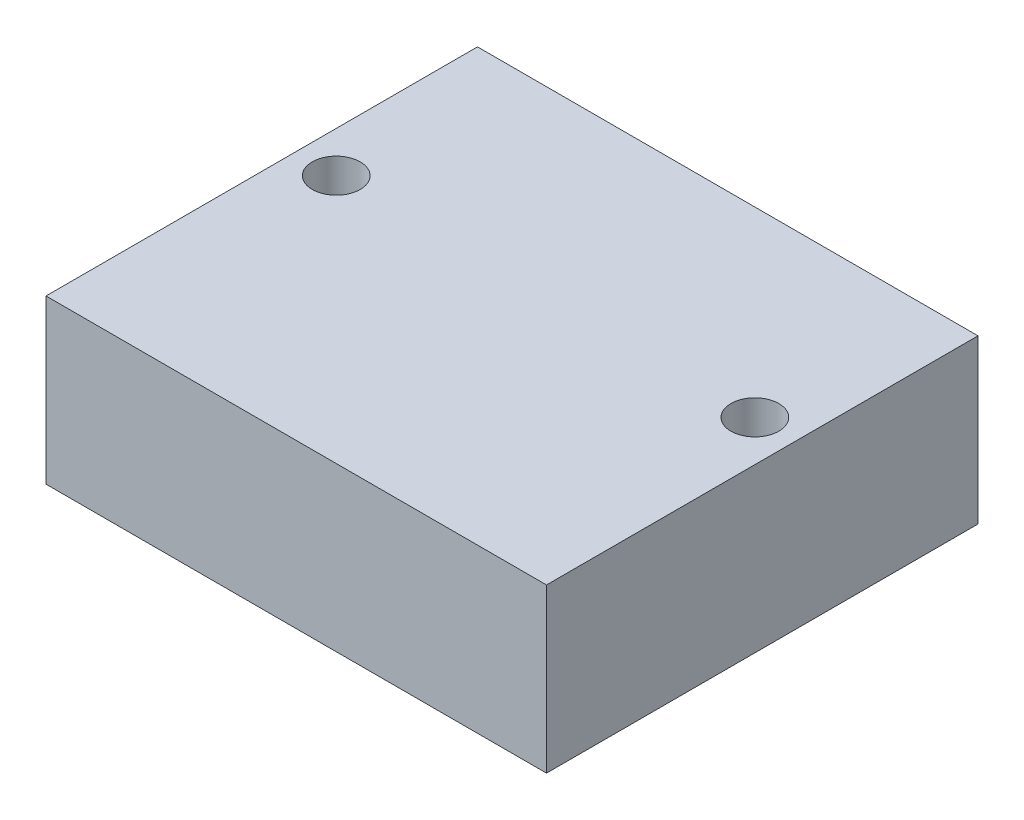
ISO-10303-21;
HEADER;
FILE_DESCRIPTION(('STEP AP214'),'2;1');
FILE_NAME('part.step','',(''),(''),'','','');
FILE_SCHEMA(('AUTOMOTIVE_DESIGN { 1 0 10303 214 1 1 1 1 }'));
ENDSEC;
DATA;
#1=APPLICATION_CONTEXT('core data for automotive mechanical design processes');
#2=APPLICATION_PROTOCOL_DEFINITION('international standard','automotive_design',2000,#1);
#3=PRODUCT_CONTEXT('',#1,'mechanical');
#4=PRODUCT('Part','Part','',(#3));
#5=PRODUCT_RELATED_PRODUCT_CATEGORY('part','',(#4));
#6=PRODUCT_DEFINITION_FORMATION('','',#4);
#7=PRODUCT_DEFINITION_CONTEXT('part definition',#1,'design');
#8=PRODUCT_DEFINITION('design','',#6,#7);
#9=PRODUCT_DEFINITION_SHAPE('','',#8);
#10=(LENGTH_UNIT() NAMED_UNIT(*) SI_UNIT(.MILLI.,.METRE.));
#11=(NAMED_UNIT(*) PLANE_ANGLE_UNIT() SI_UNIT($,.RADIAN.));
#12=(NAMED_UNIT(*) SI_UNIT($,.STERADIAN.) SOLID_ANGLE_UNIT());
#13=UNCERTAINTY_MEASURE_WITH_UNIT(LENGTH_MEASURE(1.E-05),#10,'distance_accuracy_value','');
#14=(GEOMETRIC_REPRESENTATION_CONTEXT(3) GLOBAL_UNCERTAINTY_ASSIGNED_CONTEXT((#13)) GLOBAL_UNIT_ASSIGNED_CONTEXT((#10,
#11,#12)) REPRESENTATION_CONTEXT('',''));
#15=CARTESIAN_POINT('',(0.,0.,0.));
#16=DIRECTION('',(0.,0.,1.));
#17=DIRECTION('',(1.,0.,0.));
#18=AXIS2_PLACEMENT_3D('',#15,#16,#17);
#19=CARTESIAN_POINT('',(33.147,21.59,28.575));
#20=DIRECTION('',(-1.,0.,0.));
#21=DIRECTION('',(0.,0.,1.));
#22=AXIS2_PLACEMENT_3D('',#19,#20,#21);
#23=PLANE('',#22);
#24=DIRECTION('',(0.,0.,-1.));
#25=VECTOR('',#24,1.);
#26=CARTESIAN_POINT('',(33.147,0.,28.575));
#27=LINE('',#26,#25);
#28=CARTESIAN_POINT('',(33.147,0.,28.575));
#29=VERTEX_POINT('',#28);
#30=CARTESIAN_POINT('',(33.147,0.,-28.575));
#31=VERTEX_POINT('',#30);
#32=EDGE_CURVE('E102',#29,#31,#27,.T.);
#33=ORIENTED_EDGE('',*,*,#32,.T.);
#34=DIRECTION('',(0.,-1.,0.));
#35=VECTOR('',#34,1.);
#36=CARTESIAN_POINT('',(33.147,21.59,-28.575));
#37=LINE('',#36,#35);
#38=CARTESIAN_POINT('',(33.147,21.59,-28.575));
#39=VERTEX_POINT('',#38);
#40=EDGE_CURVE('E11',#39,#31,#37,.T.);
#41=ORIENTED_EDGE('',*,*,#40,.F.);
#42=DIRECTION('',(0.,0.,-1.));
#43=VECTOR('',#42,1.);
#44=CARTESIAN_POINT('',(33.147,21.59,28.575));
#45=LINE('',#44,#43);
#46=CARTESIAN_POINT('',(33.147,21.59,28.575));
#47=VERTEX_POINT('',#46);
#48=EDGE_CURVE('E90',#47,#39,#45,.T.);
#49=ORIENTED_EDGE('',*,*,#48,.F.);
#50=DIRECTION('',(0.,-1.,0.));
#51=VECTOR('',#50,1.);
#52=CARTESIAN_POINT('',(33.147,21.59,28.575));
#53=LINE('',#52,#51);
#54=EDGE_CURVE('E98',#47,#29,#53,.T.);
#55=ORIENTED_EDGE('',*,*,#54,.T.);
#56=EDGE_LOOP('',(#33,#41,#49,#55));
#57=FACE_BOUND('',#56,.T.);
#58=ADVANCED_FACE('F39',(#57),#23,.F.);
#59=CARTESIAN_POINT('',(-33.147,21.59,-28.575));
#60=DIRECTION('',(0.,0.,1.));
#61=DIRECTION('',(1.,0.,0.));
#62=AXIS2_PLACEMENT_3D('',#59,#60,#61);
#63=PLANE('',#62);
#64=DIRECTION('',(-1.,0.,0.));
#65=VECTOR('',#64,1.);
#66=CARTESIAN_POINT('',(-33.147,0.,-28.575));
#67=LINE('',#66,#65);
#68=CARTESIAN_POINT('',(-33.147,0.,-28.575));
#69=VERTEX_POINT('',#68);
#70=EDGE_CURVE('E94',#31,#69,#67,.T.);
#71=ORIENTED_EDGE('',*,*,#70,.T.);
#72=DIRECTION('',(0.,-1.,0.));
#73=VECTOR('',#72,1.);
#74=CARTESIAN_POINT('',(-33.147,21.59,-28.575));
#75=LINE('',#74,#73);
#76=CARTESIAN_POINT('',(-33.147,21.59,-28.575));
#77=VERTEX_POINT('',#76);
#78=EDGE_CURVE('E47',#77,#69,#75,.T.);
#79=ORIENTED_EDGE('',*,*,#78,.F.);
#80=DIRECTION('',(-1.,0.,0.));
#81=VECTOR('',#80,1.);
#82=CARTESIAN_POINT('',(-33.147,21.59,-28.575));
#83=LINE('',#82,#81);
#84=EDGE_CURVE('E85',#39,#77,#83,.T.);
#85=ORIENTED_EDGE('',*,*,#84,.F.);
#86=ORIENTED_EDGE('',*,*,#40,.T.);
#87=EDGE_LOOP('',(#71,#79,#85,#86));
#88=FACE_BOUND('',#87,.T.);
#89=ADVANCED_FACE('F93',(#88),#63,.F.);
#90=CARTESIAN_POINT('',(-33.147,21.59,28.575));
#91=DIRECTION('',(1.,0.,0.));
#92=DIRECTION('',(0.,0.,-1.));
#93=AXIS2_PLACEMENT_3D('',#90,#91,#92);
#94=PLANE('',#93);
#95=DIRECTION('',(0.,0.,1.));
#96=VECTOR('',#95,1.);
#97=CARTESIAN_POINT('',(-33.147,0.,28.575));
#98=LINE('',#97,#96);
#99=CARTESIAN_POINT('',(-33.147,0.,28.575));
#100=VERTEX_POINT('',#99);
#101=EDGE_CURVE('E72',#69,#100,#98,.T.);
#102=ORIENTED_EDGE('',*,*,#101,.T.);
#103=DIRECTION('',(0.,-1.,0.));
#104=VECTOR('',#103,1.);
#105=CARTESIAN_POINT('',(-33.147,21.59,28.575));
#106=LINE('',#105,#104);
#107=CARTESIAN_POINT('',(-33.147,21.59,28.575));
#108=VERTEX_POINT('',#107);
#109=EDGE_CURVE('E95',#108,#100,#106,.T.);
#110=ORIENTED_EDGE('',*,*,#109,.F.);
#111=DIRECTION('',(0.,0.,1.));
#112=VECTOR('',#111,1.);
#113=CARTESIAN_POINT('',(-33.147,21.59,28.575));
#114=LINE('',#113,#112);
#115=EDGE_CURVE('E88',#77,#108,#114,.T.);
#116=ORIENTED_EDGE('',*,*,#115,.F.);
#117=ORIENTED_EDGE('',*,*,#78,.T.);
#118=EDGE_LOOP('',(#102,#110,#116,#117));
#119=FACE_BOUND('',#118,.T.);
#120=ADVANCED_FACE('F96',(#119),#94,.F.);
#121=CARTESIAN_POINT('',(-33.147,21.59,28.575));
#122=DIRECTION('',(0.,0.,-1.));
#123=DIRECTION('',(-1.,0.,0.));
#124=AXIS2_PLACEMENT_3D('',#121,#122,#123);
#125=PLANE('',#124);
#126=DIRECTION('',(1.,0.,0.));
#127=VECTOR('',#126,1.);
#128=CARTESIAN_POINT('',(-33.147,0.,28.575));
#129=LINE('',#128,#127);
#130=EDGE_CURVE('E78',#100,#29,#129,.T.);
#131=ORIENTED_EDGE('',*,*,#130,.T.);
#132=ORIENTED_EDGE('',*,*,#54,.F.);
#133=DIRECTION('',(1.,0.,0.));
#134=VECTOR('',#133,1.);
#135=CARTESIAN_POINT('',(-33.147,21.59,28.575));
#136=LINE('',#135,#134);
#137=EDGE_CURVE('E55',#108,#47,#136,.T.);
#138=ORIENTED_EDGE('',*,*,#137,.F.);
#139=ORIENTED_EDGE('',*,*,#109,.T.);
#140=EDGE_LOOP('',(#131,#132,#138,#139));
#141=FACE_BOUND('',#140,.T.);
#142=ADVANCED_FACE('F110',(#141),#125,.F.);
#143=CARTESIAN_POINT('',(0.,21.59,0.));
#144=DIRECTION('',(0.,-1.,0.));
#145=DIRECTION('',(0.,0.,-1.));
#146=AXIS2_PLACEMENT_3D('',#143,#144,#145);
#147=PLANE('',#146);
#148=CARTESIAN_POINT('',(-27.7241,21.59,-4.445));
#149=DIRECTION('',(0.,1.,0.));
#150=DIRECTION('',(0.,0.,1.));
#151=AXIS2_PLACEMENT_3D('',#148,#149,#150);
#152=CIRCLE('',#151,3.175);
#153=CARTESIAN_POINT('',(-27.7241,21.59,-1.27));
#154=VERTEX_POINT('',#153);
#155=EDGE_CURVE('E122',#154,#154,#152,.T.);
#156=ORIENTED_EDGE('',*,*,#155,.F.);
#157=EDGE_LOOP('',(#156));
#158=FACE_BOUND('',#157,.T.);
#159=CARTESIAN_POINT('',(27.7241,21.59,-4.445));
#160=DIRECTION('',(0.,1.,0.));
#161=DIRECTION('',(0.,0.,-1.));
#162=AXIS2_PLACEMENT_3D('',#159,#160,#161);
#163=CIRCLE('',#162,3.175);
#164=CARTESIAN_POINT('',(27.7241,21.59,-7.62));
#165=VERTEX_POINT('',#164);
#166=EDGE_CURVE('E119',#165,#165,#163,.T.);
#167=ORIENTED_EDGE('',*,*,#166,.F.);
#168=EDGE_LOOP('',(#167));
#169=FACE_BOUND('',#168,.T.);
#170=ORIENTED_EDGE('',*,*,#48,.T.);
#171=ORIENTED_EDGE('',*,*,#84,.T.);
#172=ORIENTED_EDGE('',*,*,#115,.T.);
#173=ORIENTED_EDGE('',*,*,#137,.T.);
#174=EDGE_LOOP('',(#170,#171,#172,#173));
#175=FACE_BOUND('',#174,.T.);
#176=ADVANCED_FACE('F86',(#158,#169,#175),#147,.F.);
#177=CARTESIAN_POINT('',(0.,0.,0.));
#178=DIRECTION('',(0.,-1.,0.));
#179=DIRECTION('',(0.,0.,-1.));
#180=AXIS2_PLACEMENT_3D('',#177,#178,#179);
#181=PLANE('',#180);
#182=CARTESIAN_POINT('',(-27.7241,0.,-4.445));
#183=DIRECTION('',(0.,1.,0.));
#184=DIRECTION('',(0.,0.,1.));
#185=AXIS2_PLACEMENT_3D('',#182,#183,#184);
#186=CIRCLE('',#185,3.175);
#187=CARTESIAN_POINT('',(-27.7241,0.,-1.27));
#188=VERTEX_POINT('',#187);
#189=EDGE_CURVE('E105',#188,#188,#186,.T.);
#190=ORIENTED_EDGE('',*,*,#189,.T.);
#191=EDGE_LOOP('',(#190));
#192=FACE_BOUND('',#191,.T.);
#193=CARTESIAN_POINT('',(27.7241,0.,-4.445));
#194=DIRECTION('',(0.,1.,0.));
#195=DIRECTION('',(0.,0.,-1.));
#196=AXIS2_PLACEMENT_3D('',#193,#194,#195);
#197=CIRCLE('',#196,3.175);
#198=CARTESIAN_POINT('',(27.7241,0.,-7.62));
#199=VERTEX_POINT('',#198);
#200=EDGE_CURVE('E116',#199,#199,#197,.T.);
#201=ORIENTED_EDGE('',*,*,#200,.T.);
#202=EDGE_LOOP('',(#201));
#203=FACE_BOUND('',#202,.T.);
#204=ORIENTED_EDGE('',*,*,#32,.F.);
#205=ORIENTED_EDGE('',*,*,#130,.F.);
#206=ORIENTED_EDGE('',*,*,#101,.F.);
#207=ORIENTED_EDGE('',*,*,#70,.F.);
#208=EDGE_LOOP('',(#204,#205,#206,#207));
#209=FACE_BOUND('',#208,.T.);
#210=ADVANCED_FACE('F113',(#192,#203,#209),#181,.T.);
#211=CARTESIAN_POINT('',(27.7241,0.,-4.445));
#212=DIRECTION('',(0.,1.,0.));
#213=DIRECTION('',(0.,0.,1.));
#214=AXIS2_PLACEMENT_3D('',#211,#212,#213);
#215=CYLINDRICAL_SURFACE('',#214,3.175);
#216=ORIENTED_EDGE('',*,*,#200,.F.);
#217=EDGE_LOOP('',(#216));
#218=FACE_BOUND('',#217,.T.);
#219=ORIENTED_EDGE('',*,*,#166,.T.);
#220=EDGE_LOOP('',(#219));
#221=FACE_BOUND('',#220,.T.);
#222=ADVANCED_FACE('F133',(#218,#221),#215,.F.);
#223=CARTESIAN_POINT('',(-27.7241,0.,-4.445));
#224=DIRECTION('',(0.,1.,0.));
#225=DIRECTION('',(0.,0.,1.));
#226=AXIS2_PLACEMENT_3D('',#223,#224,#225);
#227=CYLINDRICAL_SURFACE('',#226,3.175);
#228=ORIENTED_EDGE('',*,*,#189,.F.);
#229=EDGE_LOOP('',(#228));
#230=FACE_BOUND('',#229,.T.);
#231=ORIENTED_EDGE('',*,*,#155,.T.);
#232=EDGE_LOOP('',(#231));
#233=FACE_BOUND('',#232,.T.);
#234=ADVANCED_FACE('F130',(#230,#233),#227,.F.);
#235=CLOSED_SHELL('',(#58,#89,#120,#142,#176,#210,#222,#234));
#236=MANIFOLD_SOLID_BREP('B2',#235);
#237=ADVANCED_BREP_SHAPE_REPRESENTATION('',(#18,#236),#14);
#238=SHAPE_DEFINITION_REPRESENTATION(#9,#237);
ENDSEC;
END-ISO-10303-21;
